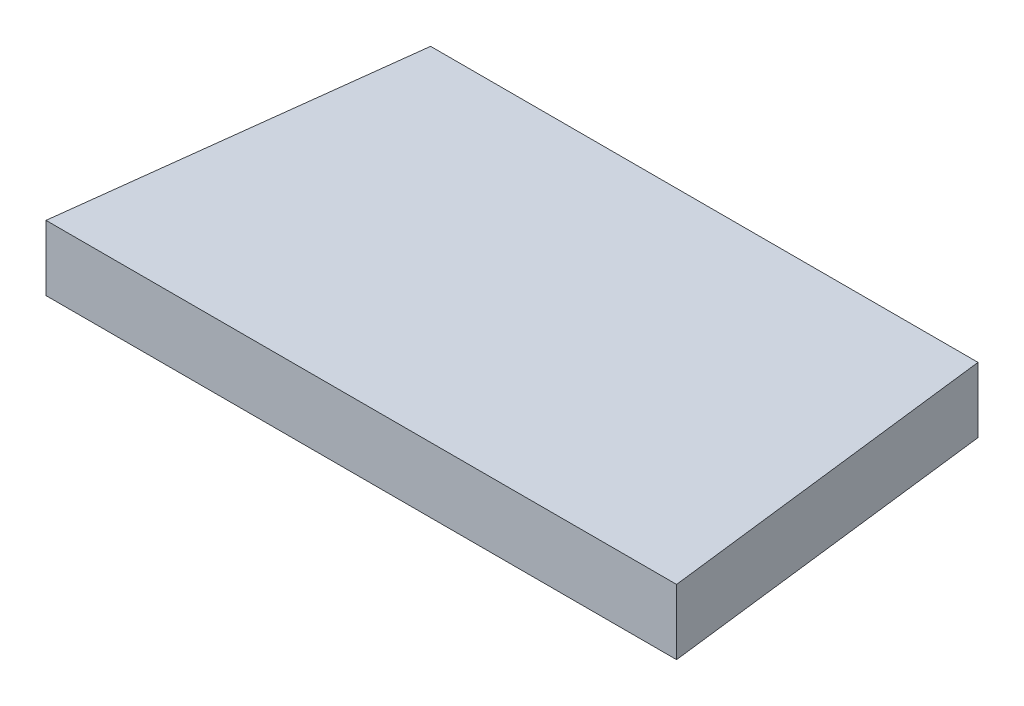
ISO-10303-21;
HEADER;
FILE_DESCRIPTION(('STEP AP214'),'2;1');
FILE_NAME('part.step','',(''),(''),'','','');
FILE_SCHEMA(('AUTOMOTIVE_DESIGN { 1 0 10303 214 1 1 1 1 }'));
ENDSEC;
DATA;
#1=APPLICATION_CONTEXT('core data for automotive mechanical design processes');
#2=APPLICATION_PROTOCOL_DEFINITION('international standard','automotive_design',2000,#1);
#3=PRODUCT_CONTEXT('',#1,'mechanical');
#4=PRODUCT('Part','Part','',(#3));
#5=PRODUCT_RELATED_PRODUCT_CATEGORY('part','',(#4));
#6=PRODUCT_DEFINITION_FORMATION('','',#4);
#7=PRODUCT_DEFINITION_CONTEXT('part definition',#1,'design');
#8=PRODUCT_DEFINITION('design','',#6,#7);
#9=PRODUCT_DEFINITION_SHAPE('','',#8);
#10=(LENGTH_UNIT() NAMED_UNIT(*) SI_UNIT(.MILLI.,.METRE.));
#11=(NAMED_UNIT(*) PLANE_ANGLE_UNIT() SI_UNIT($,.RADIAN.));
#12=(NAMED_UNIT(*) SI_UNIT($,.STERADIAN.) SOLID_ANGLE_UNIT());
#13=UNCERTAINTY_MEASURE_WITH_UNIT(LENGTH_MEASURE(1.E-05),#10,'distance_accuracy_value','');
#14=(GEOMETRIC_REPRESENTATION_CONTEXT(3) GLOBAL_UNCERTAINTY_ASSIGNED_CONTEXT((#13)) GLOBAL_UNIT_ASSIGNED_CONTEXT((#10,
#11,#12)) REPRESENTATION_CONTEXT('',''));
#15=CARTESIAN_POINT('',(0.,0.,0.));
#16=DIRECTION('',(0.,0.,1.));
#17=DIRECTION('',(1.,0.,0.));
#18=AXIS2_PLACEMENT_3D('',#15,#16,#17);
#19=CARTESIAN_POINT('',(48.9773753918264,5.,-1.69738527370275));
#20=DIRECTION('',(0.,0.,1.));
#21=DIRECTION('',(1.,0.,0.));
#22=AXIS2_PLACEMENT_3D('',#19,#20,#21);
#23=PLANE('',#22);
#24=DIRECTION('',(-1.,0.,0.));
#25=VECTOR('',#24,1.);
#26=CARTESIAN_POINT('',(48.9773753918264,0.,-1.69738527370275));
#27=LINE('',#26,#25);
#28=CARTESIAN_POINT('',(48.9773753918264,0.,-1.69738527370275));
#29=VERTEX_POINT('',#28);
#30=CARTESIAN_POINT('',(0.608725752057457,0.,-1.69738527370275));
#31=VERTEX_POINT('',#30);
#32=EDGE_CURVE('E101',#29,#31,#27,.T.);
#33=ORIENTED_EDGE('',*,*,#32,.F.);
#34=DIRECTION('',(0.,-1.,0.));
#35=VECTOR('',#34,1.);
#36=CARTESIAN_POINT('',(48.9773753918264,5.,-1.69738527370275));
#37=LINE('',#36,#35);
#38=CARTESIAN_POINT('',(48.9773753918264,5.,-1.69738527370275));
#39=VERTEX_POINT('',#38);
#40=EDGE_CURVE('E11',#39,#29,#37,.T.);
#41=ORIENTED_EDGE('',*,*,#40,.F.);
#42=DIRECTION('',(-1.,0.,0.));
#43=VECTOR('',#42,1.);
#44=CARTESIAN_POINT('',(48.9773753918264,5.,-1.69738527370275));
#45=LINE('',#44,#43);
#46=CARTESIAN_POINT('',(0.608725752057457,5.,-1.69738527370275));
#47=VERTEX_POINT('',#46);
#48=EDGE_CURVE('E95',#39,#47,#45,.T.);
#49=ORIENTED_EDGE('',*,*,#48,.T.);
#50=DIRECTION('',(0.,-1.,0.));
#51=VECTOR('',#50,1.);
#52=CARTESIAN_POINT('',(0.608725752057457,5.,-1.69738527370275));
#53=LINE('',#52,#51);
#54=EDGE_CURVE('E40',#47,#31,#53,.T.);
#55=ORIENTED_EDGE('',*,*,#54,.T.);
#56=EDGE_LOOP('',(#33,#41,#49,#55));
#57=FACE_BOUND('',#56,.T.);
#58=ADVANCED_FACE('F37',(#57),#23,.T.);
#59=CARTESIAN_POINT('',(45.7873213015999,5.,-28.0085762737027));
#60=DIRECTION('',(0.992730091030795,0.,-0.120361814384752));
#61=DIRECTION('',(-0.120361814384752,0.,-0.992730091030795));
#62=AXIS2_PLACEMENT_3D('',#59,#60,#61);
#63=PLANE('',#62);
#64=DIRECTION('',(0.120361814384752,0.,0.992730091030795));
#65=VECTOR('',#64,1.);
#66=CARTESIAN_POINT('',(45.7873213015999,0.,-28.0085762737027));
#67=LINE('',#66,#65);
#68=CARTESIAN_POINT('',(45.7873213015999,0.,-28.0085762737027));
#69=VERTEX_POINT('',#68);
#70=EDGE_CURVE('E97',#69,#29,#67,.T.);
#71=ORIENTED_EDGE('',*,*,#70,.F.);
#72=DIRECTION('',(0.,-1.,0.));
#73=VECTOR('',#72,1.);
#74=CARTESIAN_POINT('',(45.7873213015999,5.,-28.0085762737027));
#75=LINE('',#74,#73);
#76=CARTESIAN_POINT('',(45.7873213015999,5.,-28.0085762737027));
#77=VERTEX_POINT('',#76);
#78=EDGE_CURVE('E46',#77,#69,#75,.T.);
#79=ORIENTED_EDGE('',*,*,#78,.F.);
#80=DIRECTION('',(0.120361814384752,0.,0.992730091030795));
#81=VECTOR('',#80,1.);
#82=CARTESIAN_POINT('',(45.7873213015999,5.,-28.0085762737027));
#83=LINE('',#82,#81);
#84=EDGE_CURVE('E92',#77,#39,#83,.T.);
#85=ORIENTED_EDGE('',*,*,#84,.T.);
#86=ORIENTED_EDGE('',*,*,#40,.T.);
#87=EDGE_LOOP('',(#71,#79,#85,#86));
#88=FACE_BOUND('',#87,.T.);
#89=ADVANCED_FACE('F111',(#88),#63,.T.);
#90=CARTESIAN_POINT('',(3.79877984228404,5.,-28.0085762737027));
#91=DIRECTION('',(0.,0.,-1.));
#92=DIRECTION('',(-1.,0.,0.));
#93=AXIS2_PLACEMENT_3D('',#90,#91,#92);
#94=PLANE('',#93);
#95=DIRECTION('',(1.,0.,0.));
#96=VECTOR('',#95,1.);
#97=CARTESIAN_POINT('',(3.79877984228404,0.,-28.0085762737027));
#98=LINE('',#97,#96);
#99=CARTESIAN_POINT('',(3.79877984228404,0.,-28.0085762737027));
#100=VERTEX_POINT('',#99);
#101=EDGE_CURVE('E87',#100,#69,#98,.T.);
#102=ORIENTED_EDGE('',*,*,#101,.F.);
#103=DIRECTION('',(0.,-1.,0.));
#104=VECTOR('',#103,1.);
#105=CARTESIAN_POINT('',(3.79877984228404,5.,-28.0085762737027));
#106=LINE('',#105,#104);
#107=CARTESIAN_POINT('',(3.79877984228404,5.,-28.0085762737027));
#108=VERTEX_POINT('',#107);
#109=EDGE_CURVE('E82',#108,#100,#106,.T.);
#110=ORIENTED_EDGE('',*,*,#109,.F.);
#111=DIRECTION('',(1.,0.,0.));
#112=VECTOR('',#111,1.);
#113=CARTESIAN_POINT('',(3.79877984228404,5.,-28.0085762737027));
#114=LINE('',#113,#112);
#115=EDGE_CURVE('E85',#108,#77,#114,.T.);
#116=ORIENTED_EDGE('',*,*,#115,.T.);
#117=ORIENTED_EDGE('',*,*,#78,.T.);
#118=EDGE_LOOP('',(#102,#110,#116,#117));
#119=FACE_BOUND('',#118,.T.);
#120=ADVANCED_FACE('F84',(#119),#94,.T.);
#121=CARTESIAN_POINT('',(0.608725752057457,5.,-1.69738527370275));
#122=DIRECTION('',(-0.992730091030795,0.,-0.120361814384753));
#123=DIRECTION('',(-0.120361814384753,0.,0.992730091030795));
#124=AXIS2_PLACEMENT_3D('',#121,#122,#123);
#125=PLANE('',#124);
#126=DIRECTION('',(0.120361814384753,0.,-0.992730091030795));
#127=VECTOR('',#126,1.);
#128=CARTESIAN_POINT('',(0.608725752057457,0.,-1.69738527370275));
#129=LINE('',#128,#127);
#130=EDGE_CURVE('E104',#31,#100,#129,.T.);
#131=ORIENTED_EDGE('',*,*,#130,.F.);
#132=ORIENTED_EDGE('',*,*,#54,.F.);
#133=DIRECTION('',(0.120361814384753,0.,-0.992730091030795));
#134=VECTOR('',#133,1.);
#135=CARTESIAN_POINT('',(0.608725752057457,5.,-1.69738527370275));
#136=LINE('',#135,#134);
#137=EDGE_CURVE('E91',#47,#108,#136,.T.);
#138=ORIENTED_EDGE('',*,*,#137,.T.);
#139=ORIENTED_EDGE('',*,*,#109,.T.);
#140=EDGE_LOOP('',(#131,#132,#138,#139));
#141=FACE_BOUND('',#140,.T.);
#142=ADVANCED_FACE('F94',(#141),#125,.T.);
#143=CARTESIAN_POINT('',(0.,5.,0.));
#144=DIRECTION('',(0.,-1.,0.));
#145=DIRECTION('',(0.,0.,-1.));
#146=AXIS2_PLACEMENT_3D('',#143,#144,#145);
#147=PLANE('',#146);
#148=ORIENTED_EDGE('',*,*,#48,.F.);
#149=ORIENTED_EDGE('',*,*,#84,.F.);
#150=ORIENTED_EDGE('',*,*,#115,.F.);
#151=ORIENTED_EDGE('',*,*,#137,.F.);
#152=EDGE_LOOP('',(#148,#149,#150,#151));
#153=FACE_BOUND('',#152,.T.);
#154=ADVANCED_FACE('F90',(#153),#147,.F.);
#155=CARTESIAN_POINT('',(0.,0.,0.));
#156=DIRECTION('',(0.,-1.,0.));
#157=DIRECTION('',(0.,0.,-1.));
#158=AXIS2_PLACEMENT_3D('',#155,#156,#157);
#159=PLANE('',#158);
#160=ORIENTED_EDGE('',*,*,#32,.T.);
#161=ORIENTED_EDGE('',*,*,#130,.T.);
#162=ORIENTED_EDGE('',*,*,#101,.T.);
#163=ORIENTED_EDGE('',*,*,#70,.T.);
#164=EDGE_LOOP('',(#160,#161,#162,#163));
#165=FACE_BOUND('',#164,.T.);
#166=ADVANCED_FACE('F110',(#165),#159,.T.);
#167=CLOSED_SHELL('',(#58,#89,#120,#142,#154,#166));
#168=MANIFOLD_SOLID_BREP('B2',#167);
#169=ADVANCED_BREP_SHAPE_REPRESENTATION('',(#18,#168),#14);
#170=SHAPE_DEFINITION_REPRESENTATION(#9,#169);
ENDSEC;
END-ISO-10303-21;
